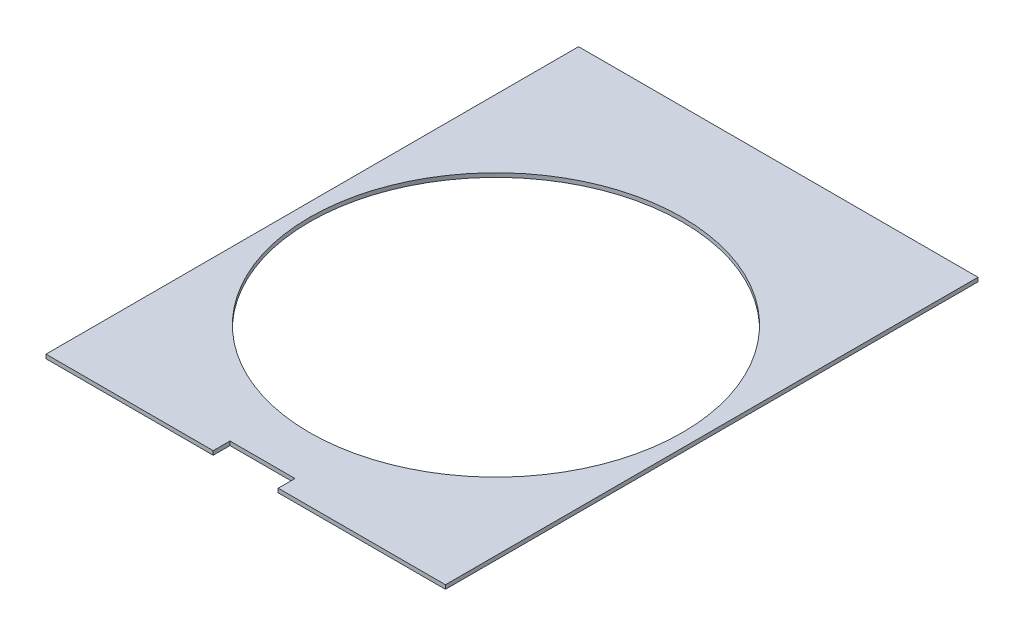
ISO-10303-21;
HEADER;
FILE_DESCRIPTION(('STEP AP214'),'2;1');
FILE_NAME('part.step','',(''),(''),'','','');
FILE_SCHEMA(('AUTOMOTIVE_DESIGN { 1 0 10303 214 1 1 1 1 }'));
ENDSEC;
DATA;
#1=APPLICATION_CONTEXT('core data for automotive mechanical design processes');
#2=APPLICATION_PROTOCOL_DEFINITION('international standard','automotive_design',2000,#1);
#3=PRODUCT_CONTEXT('',#1,'mechanical');
#4=PRODUCT('Part','Part','',(#3));
#5=PRODUCT_RELATED_PRODUCT_CATEGORY('part','',(#4));
#6=PRODUCT_DEFINITION_FORMATION('','',#4);
#7=PRODUCT_DEFINITION_CONTEXT('part definition',#1,'design');
#8=PRODUCT_DEFINITION('design','',#6,#7);
#9=PRODUCT_DEFINITION_SHAPE('','',#8);
#10=(LENGTH_UNIT() NAMED_UNIT(*) SI_UNIT(.MILLI.,.METRE.));
#11=(NAMED_UNIT(*) PLANE_ANGLE_UNIT() SI_UNIT($,.RADIAN.));
#12=(NAMED_UNIT(*) SI_UNIT($,.STERADIAN.) SOLID_ANGLE_UNIT());
#13=UNCERTAINTY_MEASURE_WITH_UNIT(LENGTH_MEASURE(1.E-05),#10,'distance_accuracy_value','');
#14=(GEOMETRIC_REPRESENTATION_CONTEXT(3) GLOBAL_UNCERTAINTY_ASSIGNED_CONTEXT((#13)) GLOBAL_UNIT_ASSIGNED_CONTEXT((#10,
#11,#12)) REPRESENTATION_CONTEXT('',''));
#15=CARTESIAN_POINT('',(0.,0.,0.));
#16=DIRECTION('',(0.,0.,1.));
#17=DIRECTION('',(1.,0.,0.));
#18=AXIS2_PLACEMENT_3D('',#15,#16,#17);
#19=CARTESIAN_POINT('',(-0.0367024047903397,3.81,690.273520924211));
#20=DIRECTION('',(0.,0.,-1.));
#21=DIRECTION('',(-1.,0.,0.));
#22=AXIS2_PLACEMENT_3D('',#19,#20,#21);
#23=PLANE('',#22);
#24=DIRECTION('',(1.,0.,0.));
#25=VECTOR('',#24,1.);
#26=CARTESIAN_POINT('',(-0.0367024047903397,3.81,690.273520924211));
#27=LINE('',#26,#25);
#28=CARTESIAN_POINT('',(221.46329759521,3.81,690.273520924211));
#29=VERTEX_POINT('',#28);
#30=CARTESIAN_POINT('',(380.96329759521,3.81,690.273520924211));
#31=VERTEX_POINT('',#30);
#32=EDGE_CURVE('E57',#29,#31,#27,.T.);
#33=ORIENTED_EDGE('',*,*,#32,.F.);
#34=DIRECTION('',(0.,1.,0.));
#35=VECTOR('',#34,1.);
#36=CARTESIAN_POINT('',(221.46329759521,0.,690.273520924211));
#37=LINE('',#36,#35);
#38=CARTESIAN_POINT('',(221.46329759521,0.,690.273520924211));
#39=VERTEX_POINT('',#38);
#40=EDGE_CURVE('E134',#39,#29,#37,.T.);
#41=ORIENTED_EDGE('',*,*,#40,.F.);
#42=DIRECTION('',(1.,0.,0.));
#43=VECTOR('',#42,1.);
#44=CARTESIAN_POINT('',(-0.0367024047903397,0.,690.273520924211));
#45=LINE('',#44,#43);
#46=CARTESIAN_POINT('',(380.96329759521,0.,690.273520924211));
#47=VERTEX_POINT('',#46);
#48=EDGE_CURVE('E79',#39,#47,#45,.T.);
#49=ORIENTED_EDGE('',*,*,#48,.T.);
#50=DIRECTION('',(0.,-1.,0.));
#51=VECTOR('',#50,1.);
#52=CARTESIAN_POINT('',(380.96329759521,3.81,690.273520924211));
#53=LINE('',#52,#51);
#54=EDGE_CURVE('E156',#31,#47,#53,.T.);
#55=ORIENTED_EDGE('',*,*,#54,.F.);
#56=EDGE_LOOP('',(#33,#41,#49,#55));
#57=FACE_BOUND('',#56,.T.);
#58=ADVANCED_FACE('F33',(#57),#23,.F.);
#59=CARTESIAN_POINT('',(380.96329759521,3.81,690.273520924211));
#60=DIRECTION('',(-1.,0.,0.));
#61=DIRECTION('',(0.,0.,1.));
#62=AXIS2_PLACEMENT_3D('',#59,#60,#61);
#63=PLANE('',#62);
#64=DIRECTION('',(0.,0.,-1.));
#65=VECTOR('',#64,1.);
#66=CARTESIAN_POINT('',(380.96329759521,0.,690.273520924211));
#67=LINE('',#66,#65);
#68=CARTESIAN_POINT('',(380.96329759521,0.,182.273520924211));
#69=VERTEX_POINT('',#68);
#70=EDGE_CURVE('E144',#47,#69,#67,.T.);
#71=ORIENTED_EDGE('',*,*,#70,.T.);
#72=DIRECTION('',(0.,-1.,0.));
#73=VECTOR('',#72,1.);
#74=CARTESIAN_POINT('',(380.96329759521,3.81,182.273520924211));
#75=LINE('',#74,#73);
#76=CARTESIAN_POINT('',(380.96329759521,3.81,182.273520924211));
#77=VERTEX_POINT('',#76);
#78=EDGE_CURVE('E11',#77,#69,#75,.T.);
#79=ORIENTED_EDGE('',*,*,#78,.F.);
#80=DIRECTION('',(0.,0.,-1.));
#81=VECTOR('',#80,1.);
#82=CARTESIAN_POINT('',(380.96329759521,3.81,690.273520924211));
#83=LINE('',#82,#81);
#84=EDGE_CURVE('E147',#31,#77,#83,.T.);
#85=ORIENTED_EDGE('',*,*,#84,.F.);
#86=ORIENTED_EDGE('',*,*,#54,.T.);
#87=EDGE_LOOP('',(#71,#79,#85,#86));
#88=FACE_BOUND('',#87,.T.);
#89=ADVANCED_FACE('F35',(#88),#63,.F.);
#90=CARTESIAN_POINT('',(-0.0367024047903397,3.81,182.273520924211));
#91=DIRECTION('',(0.,0.,1.));
#92=DIRECTION('',(1.,0.,0.));
#93=AXIS2_PLACEMENT_3D('',#90,#91,#92);
#94=PLANE('',#93);
#95=DIRECTION('',(-1.,0.,0.));
#96=VECTOR('',#95,1.);
#97=CARTESIAN_POINT('',(-0.0367024047903397,0.,182.273520924211));
#98=LINE('',#97,#96);
#99=CARTESIAN_POINT('',(-0.0367024047903397,0.,182.273520924211));
#100=VERTEX_POINT('',#99);
#101=EDGE_CURVE('E159',#69,#100,#98,.T.);
#102=ORIENTED_EDGE('',*,*,#101,.T.);
#103=DIRECTION('',(0.,-1.,0.));
#104=VECTOR('',#103,1.);
#105=CARTESIAN_POINT('',(-0.0367024047903397,3.81,182.273520924211));
#106=LINE('',#105,#104);
#107=CARTESIAN_POINT('',(-0.0367024047903397,3.81,182.273520924211));
#108=VERTEX_POINT('',#107);
#109=EDGE_CURVE('E41',#108,#100,#106,.T.);
#110=ORIENTED_EDGE('',*,*,#109,.F.);
#111=DIRECTION('',(-1.,0.,0.));
#112=VECTOR('',#111,1.);
#113=CARTESIAN_POINT('',(-0.0367024047903397,3.81,182.273520924211));
#114=LINE('',#113,#112);
#115=EDGE_CURVE('E86',#77,#108,#114,.T.);
#116=ORIENTED_EDGE('',*,*,#115,.F.);
#117=ORIENTED_EDGE('',*,*,#78,.T.);
#118=EDGE_LOOP('',(#102,#110,#116,#117));
#119=FACE_BOUND('',#118,.T.);
#120=ADVANCED_FACE('F183',(#119),#94,.F.);
#121=CARTESIAN_POINT('',(-0.0367024047903397,3.81,690.273520924211));
#122=DIRECTION('',(1.,0.,0.));
#123=DIRECTION('',(0.,0.,-1.));
#124=AXIS2_PLACEMENT_3D('',#121,#122,#123);
#125=PLANE('',#124);
#126=DIRECTION('',(0.,0.,1.));
#127=VECTOR('',#126,1.);
#128=CARTESIAN_POINT('',(-0.0367024047903397,0.,690.273520924211));
#129=LINE('',#128,#127);
#130=CARTESIAN_POINT('',(-0.0367024047903397,0.,690.273520924211));
#131=VERTEX_POINT('',#130);
#132=EDGE_CURVE('E161',#100,#131,#129,.T.);
#133=ORIENTED_EDGE('',*,*,#132,.T.);
#134=DIRECTION('',(0.,-1.,0.));
#135=VECTOR('',#134,1.);
#136=CARTESIAN_POINT('',(-0.0367024047903397,3.81,690.273520924211));
#137=LINE('',#136,#135);
#138=CARTESIAN_POINT('',(-0.0367024047903397,3.81,690.273520924211));
#139=VERTEX_POINT('',#138);
#140=EDGE_CURVE('E166',#139,#131,#137,.T.);
#141=ORIENTED_EDGE('',*,*,#140,.F.);
#142=DIRECTION('',(0.,0.,1.));
#143=VECTOR('',#142,1.);
#144=CARTESIAN_POINT('',(-0.0367024047903397,3.81,690.273520924211));
#145=LINE('',#144,#143);
#146=EDGE_CURVE('E151',#108,#139,#145,.T.);
#147=ORIENTED_EDGE('',*,*,#146,.F.);
#148=ORIENTED_EDGE('',*,*,#109,.T.);
#149=EDGE_LOOP('',(#133,#141,#147,#148));
#150=FACE_BOUND('',#149,.T.);
#151=ADVANCED_FACE('F172',(#150),#125,.F.);
#152=CARTESIAN_POINT('',(159.46329759521,0.,690.273520924211));
#153=VERTEX_POINT('',#152);
#154=EDGE_CURVE('E149',#131,#153,#45,.T.);
#155=ORIENTED_EDGE('',*,*,#154,.T.);
#156=DIRECTION('',(0.,1.,0.));
#157=VECTOR('',#156,1.);
#158=CARTESIAN_POINT('',(159.46329759521,0.,690.273520924211));
#159=LINE('',#158,#157);
#160=CARTESIAN_POINT('',(159.46329759521,3.81,690.273520924211));
#161=VERTEX_POINT('',#160);
#162=EDGE_CURVE('E137',#153,#161,#159,.T.);
#163=ORIENTED_EDGE('',*,*,#162,.T.);
#164=EDGE_CURVE('E153',#139,#161,#27,.T.);
#165=ORIENTED_EDGE('',*,*,#164,.F.);
#166=ORIENTED_EDGE('',*,*,#140,.T.);
#167=EDGE_LOOP('',(#155,#163,#165,#166));
#168=FACE_BOUND('',#167,.T.);
#169=ADVANCED_FACE('F176',(#168),#23,.F.);
#170=CARTESIAN_POINT('',(0.,3.81,0.));
#171=DIRECTION('',(0.,-1.,0.));
#172=DIRECTION('',(0.,0.,-1.));
#173=AXIS2_PLACEMENT_3D('',#170,#171,#172);
#174=PLANE('',#173);
#175=CARTESIAN_POINT('',(190.46329759521,3.81,451.583397082111));
#176=DIRECTION('',(0.,1.,0.));
#177=DIRECTION('',(0.,0.,1.));
#178=AXIS2_PLACEMENT_3D('',#175,#176,#177);
#179=CIRCLE('',#178,177.8);
#180=CARTESIAN_POINT('',(190.46329759521,3.81,629.383397082111));
#181=VERTEX_POINT('',#180);
#182=EDGE_CURVE('E136',#181,#181,#179,.T.);
#183=ORIENTED_EDGE('',*,*,#182,.F.);
#184=EDGE_LOOP('',(#183));
#185=FACE_BOUND('',#184,.T.);
#186=DIRECTION('',(-1.,0.,0.));
#187=VECTOR('',#186,1.);
#188=CARTESIAN_POINT('',(159.46329759521,3.81,674.273520924211));
#189=LINE('',#188,#187);
#190=CARTESIAN_POINT('',(221.46329759521,3.81,674.273520924211));
#191=VERTEX_POINT('',#190);
#192=CARTESIAN_POINT('',(159.46329759521,3.81,674.273520924211));
#193=VERTEX_POINT('',#192);
#194=EDGE_CURVE('E128',#191,#193,#189,.T.);
#195=ORIENTED_EDGE('',*,*,#194,.F.);
#196=DIRECTION('',(0.,0.,-1.));
#197=VECTOR('',#196,1.);
#198=CARTESIAN_POINT('',(221.46329759521,3.81,690.273520924211));
#199=LINE('',#198,#197);
#200=EDGE_CURVE('E112',#29,#191,#199,.T.);
#201=ORIENTED_EDGE('',*,*,#200,.F.);
#202=ORIENTED_EDGE('',*,*,#32,.T.);
#203=ORIENTED_EDGE('',*,*,#84,.T.);
#204=ORIENTED_EDGE('',*,*,#115,.T.);
#205=ORIENTED_EDGE('',*,*,#146,.T.);
#206=ORIENTED_EDGE('',*,*,#164,.T.);
#207=DIRECTION('',(0.,0.,1.));
#208=VECTOR('',#207,1.);
#209=CARTESIAN_POINT('',(159.46329759521,3.81,690.273520924211));
#210=LINE('',#209,#208);
#211=EDGE_CURVE('E126',#193,#161,#210,.T.);
#212=ORIENTED_EDGE('',*,*,#211,.F.);
#213=EDGE_LOOP('',(#195,#201,#202,#203,#204,#205,#206,#212));
#214=FACE_BOUND('',#213,.T.);
#215=ADVANCED_FACE('F179',(#185,#214),#174,.F.);
#216=CARTESIAN_POINT('',(0.,0.,0.));
#217=DIRECTION('',(0.,-1.,0.));
#218=DIRECTION('',(0.,0.,-1.));
#219=AXIS2_PLACEMENT_3D('',#216,#217,#218);
#220=PLANE('',#219);
#221=DIRECTION('',(0.,0.,-1.));
#222=VECTOR('',#221,1.);
#223=CARTESIAN_POINT('',(221.46329759521,0.,690.273520924211));
#224=LINE('',#223,#222);
#225=CARTESIAN_POINT('',(221.46329759521,0.,674.273520924211));
#226=VERTEX_POINT('',#225);
#227=EDGE_CURVE('E111',#39,#226,#224,.T.);
#228=ORIENTED_EDGE('',*,*,#227,.T.);
#229=DIRECTION('',(-1.,0.,0.));
#230=VECTOR('',#229,1.);
#231=CARTESIAN_POINT('',(159.46329759521,0.,674.273520924211));
#232=LINE('',#231,#230);
#233=CARTESIAN_POINT('',(159.46329759521,0.,674.273520924211));
#234=VERTEX_POINT('',#233);
#235=EDGE_CURVE('E119',#226,#234,#232,.T.);
#236=ORIENTED_EDGE('',*,*,#235,.T.);
#237=DIRECTION('',(0.,0.,1.));
#238=VECTOR('',#237,1.);
#239=CARTESIAN_POINT('',(159.46329759521,0.,690.273520924211));
#240=LINE('',#239,#238);
#241=EDGE_CURVE('E48',#234,#153,#240,.T.);
#242=ORIENTED_EDGE('',*,*,#241,.T.);
#243=ORIENTED_EDGE('',*,*,#154,.F.);
#244=ORIENTED_EDGE('',*,*,#132,.F.);
#245=ORIENTED_EDGE('',*,*,#101,.F.);
#246=ORIENTED_EDGE('',*,*,#70,.F.);
#247=ORIENTED_EDGE('',*,*,#48,.F.);
#248=EDGE_LOOP('',(#228,#236,#242,#243,#244,#245,#246,#247));
#249=FACE_BOUND('',#248,.T.);
#250=CARTESIAN_POINT('',(190.46329759521,0.,451.583397082111));
#251=DIRECTION('',(0.,1.,0.));
#252=DIRECTION('',(0.,0.,1.));
#253=AXIS2_PLACEMENT_3D('',#250,#251,#252);
#254=CIRCLE('',#253,177.8);
#255=CARTESIAN_POINT('',(190.46329759521,0.,629.383397082111));
#256=VERTEX_POINT('',#255);
#257=EDGE_CURVE('E141',#256,#256,#254,.T.);
#258=ORIENTED_EDGE('',*,*,#257,.T.);
#259=EDGE_LOOP('',(#258));
#260=FACE_BOUND('',#259,.T.);
#261=ADVANCED_FACE('F123',(#249,#260),#220,.T.);
#262=CARTESIAN_POINT('',(190.46329759521,0.,451.583397082111));
#263=DIRECTION('',(0.,1.,0.));
#264=DIRECTION('',(0.,0.,1.));
#265=AXIS2_PLACEMENT_3D('',#262,#263,#264);
#266=CYLINDRICAL_SURFACE('',#265,177.8);
#267=CARTESIAN_POINT('',(190.46329759521,0.,629.383397082111));
#268=CARTESIAN_POINT('',(190.46329759521,0.0396874999999999,629.383397082111));
#269=CARTESIAN_POINT('',(190.46329759521,0.079375,629.383397082111));
#270=CARTESIAN_POINT('',(190.46329759521,0.15875,629.383397082111));
#271=CARTESIAN_POINT('',(190.46329759521,0.1984375,629.383397082111));
#272=CARTESIAN_POINT('',(190.46329759521,0.2778125,629.383397082111));
#273=CARTESIAN_POINT('',(190.46329759521,0.3175,629.383397082111));
#274=CARTESIAN_POINT('',(190.46329759521,0.396875,629.383397082111));
#275=CARTESIAN_POINT('',(190.46329759521,0.4365625,629.383397082111));
#276=CARTESIAN_POINT('',(190.46329759521,0.5159375,629.383397082111));
#277=CARTESIAN_POINT('',(190.46329759521,0.555625,629.383397082111));
#278=CARTESIAN_POINT('',(190.46329759521,0.635,629.383397082111));
#279=CARTESIAN_POINT('',(190.46329759521,0.6746875,629.383397082111));
#280=CARTESIAN_POINT('',(190.46329759521,0.7540625,629.383397082111));
#281=CARTESIAN_POINT('',(190.46329759521,0.79375,629.383397082111));
#282=CARTESIAN_POINT('',(190.46329759521,0.873125,629.383397082111));
#283=CARTESIAN_POINT('',(190.46329759521,0.9128125,629.383397082111));
#284=CARTESIAN_POINT('',(190.46329759521,0.9921875,629.383397082111));
#285=CARTESIAN_POINT('',(190.46329759521,1.031875,629.383397082111));
#286=CARTESIAN_POINT('',(190.46329759521,1.11125,629.383397082111));
#287=CARTESIAN_POINT('',(190.46329759521,1.1509375,629.383397082111));
#288=CARTESIAN_POINT('',(190.46329759521,1.2303125,629.383397082111));
#289=CARTESIAN_POINT('',(190.46329759521,1.27,629.383397082111));
#290=CARTESIAN_POINT('',(190.46329759521,1.349375,629.383397082111));
#291=CARTESIAN_POINT('',(190.46329759521,1.3890625,629.383397082111));
#292=CARTESIAN_POINT('',(190.46329759521,1.4684375,629.383397082111));
#293=CARTESIAN_POINT('',(190.46329759521,1.508125,629.383397082111));
#294=CARTESIAN_POINT('',(190.46329759521,1.5875,629.383397082111));
#295=CARTESIAN_POINT('',(190.46329759521,1.6271875,629.383397082111));
#296=CARTESIAN_POINT('',(190.46329759521,1.7065625,629.383397082111));
#297=CARTESIAN_POINT('',(190.46329759521,1.74625,629.383397082111));
#298=CARTESIAN_POINT('',(190.46329759521,1.825625,629.383397082111));
#299=CARTESIAN_POINT('',(190.46329759521,1.8653125,629.383397082111));
#300=CARTESIAN_POINT('',(190.46329759521,1.9446875,629.383397082111));
#301=CARTESIAN_POINT('',(190.46329759521,1.984375,629.383397082111));
#302=CARTESIAN_POINT('',(190.46329759521,2.06375,629.383397082111));
#303=CARTESIAN_POINT('',(190.46329759521,2.1034375,629.383397082111));
#304=CARTESIAN_POINT('',(190.46329759521,2.1828125,629.383397082111));
#305=CARTESIAN_POINT('',(190.46329759521,2.2225,629.383397082111));
#306=CARTESIAN_POINT('',(190.46329759521,2.301875,629.383397082111));
#307=CARTESIAN_POINT('',(190.46329759521,2.3415625,629.383397082111));
#308=CARTESIAN_POINT('',(190.46329759521,2.4209375,629.383397082111));
#309=CARTESIAN_POINT('',(190.46329759521,2.460625,629.383397082111));
#310=CARTESIAN_POINT('',(190.46329759521,2.54,629.383397082111));
#311=CARTESIAN_POINT('',(190.46329759521,2.5796875,629.383397082111));
#312=CARTESIAN_POINT('',(190.46329759521,2.6590625,629.383397082111));
#313=CARTESIAN_POINT('',(190.46329759521,2.69875,629.383397082111));
#314=CARTESIAN_POINT('',(190.46329759521,2.778125,629.383397082111));
#315=CARTESIAN_POINT('',(190.46329759521,2.8178125,629.383397082111));
#316=CARTESIAN_POINT('',(190.46329759521,2.8971875,629.383397082111));
#317=CARTESIAN_POINT('',(190.46329759521,2.936875,629.383397082111));
#318=CARTESIAN_POINT('',(190.46329759521,3.01625,629.383397082111));
#319=CARTESIAN_POINT('',(190.46329759521,3.0559375,629.383397082111));
#320=CARTESIAN_POINT('',(190.46329759521,3.1353125,629.383397082111));
#321=CARTESIAN_POINT('',(190.46329759521,3.175,629.383397082111));
#322=CARTESIAN_POINT('',(190.46329759521,3.254375,629.383397082111));
#323=CARTESIAN_POINT('',(190.46329759521,3.2940625,629.383397082111));
#324=CARTESIAN_POINT('',(190.46329759521,3.3734375,629.383397082111));
#325=CARTESIAN_POINT('',(190.46329759521,3.413125,629.383397082111));
#326=CARTESIAN_POINT('',(190.46329759521,3.4925,629.383397082111));
#327=CARTESIAN_POINT('',(190.46329759521,3.5321875,629.383397082111));
#328=CARTESIAN_POINT('',(190.46329759521,3.6115625,629.383397082111));
#329=CARTESIAN_POINT('',(190.46329759521,3.65125,629.383397082111));
#330=CARTESIAN_POINT('',(190.46329759521,3.730625,629.383397082111));
#331=CARTESIAN_POINT('',(190.46329759521,3.7703125,629.383397082111));
#332=CARTESIAN_POINT('',(190.46329759521,3.81,629.383397082111));
#333=B_SPLINE_CURVE_WITH_KNOTS('',3,(#267,#268,#269,#270,#271,#272,#273,#274,#275,#276,#277,
#278,#279,#280,#281,#282,#283,#284,#285,#286,#287,#288,#289,#290,#291,#292,#293,#294,#295,#296,
#297,#298,#299,#300,#301,#302,#303,#304,#305,#306,#307,#308,#309,#310,#311,#312,#313,#314,#315,
#316,#317,#318,#319,#320,#321,#322,#323,#324,#325,#326,#327,#328,#329,#330,#331,#332),
.UNSPECIFIED.,.F.,.F.,(4,2,2,2,2,2,2,2,2,2,2,2,2,2,2,2,2,2,2,2,2,2,2,2,2,2,2,2,2,2,2,2,4),(0.,
0.1190625,0.238125,0.3571875,0.47625,0.5953125,0.714375,0.8334375,0.9525,1.0715625,1.190625,
1.3096875,1.42875,1.5478125,1.666875,1.7859375,1.905,2.0240625,2.143125,2.2621875,2.38125,
2.5003125,2.619375,2.7384375,2.8575,2.9765625,3.095625,3.2146875,3.33375,3.4528125,3.571875,
3.6909375,3.81),.UNSPECIFIED.);
#334=EDGE_CURVE('BSEAM204',#256,#181,#333,.T.);
#335=ORIENTED_EDGE('',*,*,#257,.F.);
#336=ORIENTED_EDGE('',*,*,#182,.T.);
#337=ORIENTED_EDGE('',*,*,#334,.T.);
#338=ORIENTED_EDGE('',*,*,#334,.F.);
#339=EDGE_LOOP('',(#335,#337,#336,#338));
#340=FACE_BOUND('',#339,.T.);
#341=ADVANCED_FACE('F204',(#340),#266,.F.);
#342=CARTESIAN_POINT('',(221.46329759521,0.,690.273520924211));
#343=DIRECTION('',(1.,0.,0.));
#344=DIRECTION('',(0.,0.,-1.));
#345=AXIS2_PLACEMENT_3D('',#342,#343,#344);
#346=PLANE('',#345);
#347=ORIENTED_EDGE('',*,*,#200,.T.);
#348=DIRECTION('',(0.,1.,0.));
#349=VECTOR('',#348,1.);
#350=CARTESIAN_POINT('',(221.46329759521,0.,674.273520924211));
#351=LINE('',#350,#349);
#352=EDGE_CURVE('E107',#226,#191,#351,.T.);
#353=ORIENTED_EDGE('',*,*,#352,.F.);
#354=ORIENTED_EDGE('',*,*,#227,.F.);
#355=ORIENTED_EDGE('',*,*,#40,.T.);
#356=EDGE_LOOP('',(#347,#353,#354,#355));
#357=FACE_BOUND('',#356,.T.);
#358=ADVANCED_FACE('F109',(#357),#346,.F.);
#359=CARTESIAN_POINT('',(159.46329759521,0.,690.273520924211));
#360=DIRECTION('',(-1.,0.,0.));
#361=DIRECTION('',(0.,0.,1.));
#362=AXIS2_PLACEMENT_3D('',#359,#360,#361);
#363=PLANE('',#362);
#364=ORIENTED_EDGE('',*,*,#211,.T.);
#365=ORIENTED_EDGE('',*,*,#162,.F.);
#366=ORIENTED_EDGE('',*,*,#241,.F.);
#367=DIRECTION('',(0.,1.,0.));
#368=VECTOR('',#367,1.);
#369=CARTESIAN_POINT('',(159.46329759521,0.,674.273520924211));
#370=LINE('',#369,#368);
#371=EDGE_CURVE('E116',#234,#193,#370,.T.);
#372=ORIENTED_EDGE('',*,*,#371,.T.);
#373=EDGE_LOOP('',(#364,#365,#366,#372));
#374=FACE_BOUND('',#373,.T.);
#375=ADVANCED_FACE('F212',(#374),#363,.F.);
#376=CARTESIAN_POINT('',(159.46329759521,0.,674.273520924211));
#377=DIRECTION('',(0.,0.,-1.));
#378=DIRECTION('',(-1.,0.,0.));
#379=AXIS2_PLACEMENT_3D('',#376,#377,#378);
#380=PLANE('',#379);
#381=ORIENTED_EDGE('',*,*,#194,.T.);
#382=ORIENTED_EDGE('',*,*,#371,.F.);
#383=ORIENTED_EDGE('',*,*,#235,.F.);
#384=ORIENTED_EDGE('',*,*,#352,.T.);
#385=EDGE_LOOP('',(#381,#382,#383,#384));
#386=FACE_BOUND('',#385,.T.);
#387=ADVANCED_FACE('F120',(#386),#380,.F.);
#388=CLOSED_SHELL('',(#58,#89,#120,#151,#169,#215,#261,#341,#358,#375,#387));
#389=MANIFOLD_SOLID_BREP('B2',#388);
#390=ADVANCED_BREP_SHAPE_REPRESENTATION('',(#18,#389),#14);
#391=SHAPE_DEFINITION_REPRESENTATION(#9,#390);
ENDSEC;
END-ISO-10303-21;
